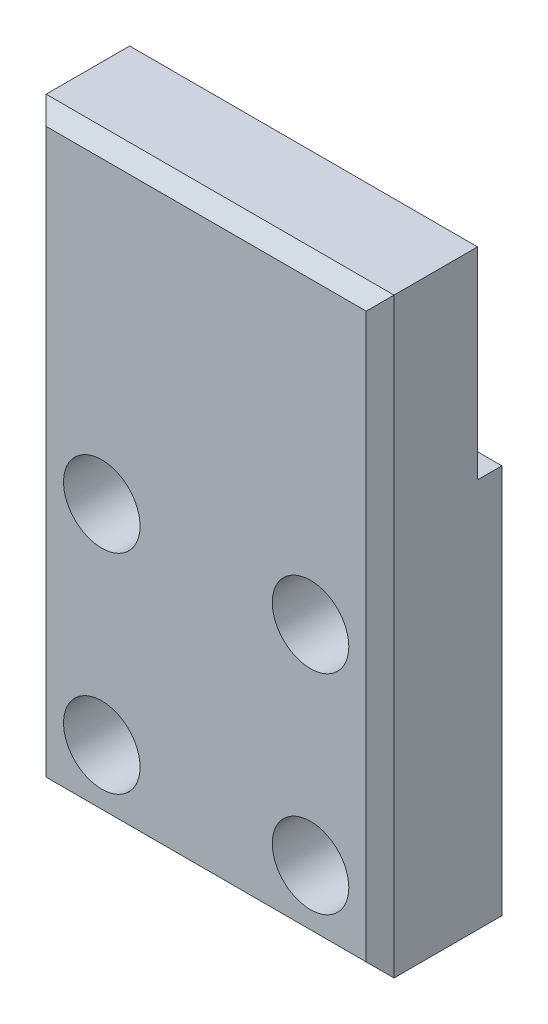
ISO-10303-21;
HEADER;
FILE_DESCRIPTION(('STEP AP214'),'2;1');
FILE_NAME('part.step','',(''),(''),'','','');
FILE_SCHEMA(('AUTOMOTIVE_DESIGN { 1 0 10303 214 1 1 1 1 }'));
ENDSEC;
DATA;
#1=APPLICATION_CONTEXT('core data for automotive mechanical design processes');
#2=APPLICATION_PROTOCOL_DEFINITION('international standard','automotive_design',2000,#1);
#3=PRODUCT_CONTEXT('',#1,'mechanical');
#4=PRODUCT('Part','Part','',(#3));
#5=PRODUCT_RELATED_PRODUCT_CATEGORY('part','',(#4));
#6=PRODUCT_DEFINITION_FORMATION('','',#4);
#7=PRODUCT_DEFINITION_CONTEXT('part definition',#1,'design');
#8=PRODUCT_DEFINITION('design','',#6,#7);
#9=PRODUCT_DEFINITION_SHAPE('','',#8);
#10=(LENGTH_UNIT() NAMED_UNIT(*) SI_UNIT(.MILLI.,.METRE.));
#11=(NAMED_UNIT(*) PLANE_ANGLE_UNIT() SI_UNIT($,.RADIAN.));
#12=(NAMED_UNIT(*) SI_UNIT($,.STERADIAN.) SOLID_ANGLE_UNIT());
#13=UNCERTAINTY_MEASURE_WITH_UNIT(LENGTH_MEASURE(1.E-05),#10,'distance_accuracy_value','');
#14=(GEOMETRIC_REPRESENTATION_CONTEXT(3) GLOBAL_UNCERTAINTY_ASSIGNED_CONTEXT((#13)) GLOBAL_UNIT_ASSIGNED_CONTEXT((#10,
#11,#12)) REPRESENTATION_CONTEXT('',''));
#15=CARTESIAN_POINT('',(0.,0.,0.));
#16=DIRECTION('',(0.,0.,1.));
#17=DIRECTION('',(1.,0.,0.));
#18=AXIS2_PLACEMENT_3D('',#15,#16,#17);
#19=CARTESIAN_POINT('',(0.,0.,300.));
#20=DIRECTION('',(0.,0.,-1.));
#21=DIRECTION('',(-1.,0.,0.));
#22=AXIS2_PLACEMENT_3D('',#19,#20,#21);
#23=PLANE('',#22);
#24=CARTESIAN_POINT('',(85.,50.,300.));
#25=DIRECTION('',(0.,0.,1.));
#26=DIRECTION('',(1.,0.,0.));
#27=AXIS2_PLACEMENT_3D('',#24,#25,#26);
#28=CIRCLE('',#27,5.5);
#29=CARTESIAN_POINT('',(90.5,50.,300.));
#30=VERTEX_POINT('',#29);
#31=EDGE_CURVE('E130',#30,#30,#28,.T.);
#32=ORIENTED_EDGE('',*,*,#31,.T.);
#33=EDGE_LOOP('',(#32));
#34=FACE_BOUND('',#33,.T.);
#35=CARTESIAN_POINT('',(115.,50.,300.));
#36=DIRECTION('',(0.,0.,1.));
#37=DIRECTION('',(1.,0.,0.));
#38=AXIS2_PLACEMENT_3D('',#35,#36,#37);
#39=CIRCLE('',#38,5.5);
#40=CARTESIAN_POINT('',(120.5,50.,300.));
#41=VERTEX_POINT('',#40);
#42=EDGE_CURVE('E136',#41,#41,#39,.T.);
#43=ORIENTED_EDGE('',*,*,#42,.T.);
#44=EDGE_LOOP('',(#43));
#45=FACE_BOUND('',#44,.T.);
#46=DIRECTION('',(1.,0.,0.));
#47=VECTOR('',#46,1.);
#48=CARTESIAN_POINT('',(115.,10.,300.));
#49=LINE('',#48,#47);
#50=CARTESIAN_POINT('',(75.,10.,300.));
#51=VERTEX_POINT('',#50);
#52=CARTESIAN_POINT('',(125.,10.,300.));
#53=VERTEX_POINT('',#52);
#54=EDGE_CURVE('E139',#51,#53,#49,.T.);
#55=ORIENTED_EDGE('',*,*,#54,.F.);
#56=DIRECTION('',(0.,-1.,0.));
#57=VECTOR('',#56,1.);
#58=CARTESIAN_POINT('',(75.,60.,300.));
#59=LINE('',#58,#57);
#60=CARTESIAN_POINT('',(75.,66.,300.));
#61=VERTEX_POINT('',#60);
#62=EDGE_CURVE('E143',#61,#51,#59,.T.);
#63=ORIENTED_EDGE('',*,*,#62,.F.);
#64=DIRECTION('',(-1.,0.,0.));
#65=VECTOR('',#64,1.);
#66=CARTESIAN_POINT('',(75.,66.,300.));
#67=LINE('',#66,#65);
#68=CARTESIAN_POINT('',(125.,66.,300.));
#69=VERTEX_POINT('',#68);
#70=EDGE_CURVE('E148',#69,#61,#67,.T.);
#71=ORIENTED_EDGE('',*,*,#70,.F.);
#72=DIRECTION('',(0.,1.,0.));
#73=VECTOR('',#72,1.);
#74=CARTESIAN_POINT('',(125.,60.,300.));
#75=LINE('',#74,#73);
#76=EDGE_CURVE('E146',#53,#69,#75,.T.);
#77=ORIENTED_EDGE('',*,*,#76,.F.);
#78=EDGE_LOOP('',(#55,#63,#71,#77));
#79=FACE_BOUND('',#78,.T.);
#80=CARTESIAN_POINT('',(85.,20.,300.));
#81=DIRECTION('',(0.,0.,1.));
#82=DIRECTION('',(1.,0.,0.));
#83=AXIS2_PLACEMENT_3D('',#80,#81,#82);
#84=CIRCLE('',#83,5.5);
#85=CARTESIAN_POINT('',(90.5,20.,300.));
#86=VERTEX_POINT('',#85);
#87=EDGE_CURVE('E133',#86,#86,#84,.T.);
#88=ORIENTED_EDGE('',*,*,#87,.T.);
#89=EDGE_LOOP('',(#88));
#90=FACE_BOUND('',#89,.T.);
#91=CARTESIAN_POINT('',(115.,20.,300.));
#92=DIRECTION('',(0.,0.,1.));
#93=DIRECTION('',(1.,0.,0.));
#94=AXIS2_PLACEMENT_3D('',#91,#92,#93);
#95=CIRCLE('',#94,5.5);
#96=CARTESIAN_POINT('',(120.5,20.,300.));
#97=VERTEX_POINT('',#96);
#98=EDGE_CURVE('E106',#97,#97,#95,.T.);
#99=ORIENTED_EDGE('',*,*,#98,.T.);
#100=EDGE_LOOP('',(#99));
#101=FACE_BOUND('',#100,.T.);
#102=ADVANCED_FACE('F35',(#34,#45,#79,#90,#101),#23,.T.);
#103=CARTESIAN_POINT('',(115.,10.,303.5));
#104=DIRECTION('',(0.,1.,0.));
#105=DIRECTION('',(0.,0.,1.));
#106=AXIS2_PLACEMENT_3D('',#103,#104,#105);
#107=PLANE('',#106);
#108=DIRECTION('',(0.,0.,-1.));
#109=VECTOR('',#108,1.);
#110=CARTESIAN_POINT('',(125.,10.,303.5));
#111=LINE('',#110,#109);
#112=CARTESIAN_POINT('',(125.,10.,315.5));
#113=VERTEX_POINT('',#112);
#114=EDGE_CURVE('E155',#113,#53,#111,.T.);
#115=ORIENTED_EDGE('',*,*,#114,.F.);
#116=DIRECTION('',(-1.,0.,0.));
#117=VECTOR('',#116,1.);
#118=CARTESIAN_POINT('',(115.,10.,315.5));
#119=LINE('',#118,#117);
#120=CARTESIAN_POINT('',(75.,10.,315.5));
#121=VERTEX_POINT('',#120);
#122=EDGE_CURVE('E168',#113,#121,#119,.T.);
#123=ORIENTED_EDGE('',*,*,#122,.T.);
#124=DIRECTION('',(0.,0.,-1.));
#125=VECTOR('',#124,1.);
#126=CARTESIAN_POINT('',(75.,10.,303.5));
#127=LINE('',#126,#125);
#128=EDGE_CURVE('E157',#121,#51,#127,.T.);
#129=ORIENTED_EDGE('',*,*,#128,.T.);
#130=ORIENTED_EDGE('',*,*,#54,.T.);
#131=EDGE_LOOP('',(#115,#123,#129,#130));
#132=FACE_BOUND('',#131,.T.);
#133=ADVANCED_FACE('F230',(#132),#107,.F.);
#134=CARTESIAN_POINT('',(125.,60.,303.5));
#135=DIRECTION('',(-1.,0.,0.));
#136=DIRECTION('',(0.,0.,1.));
#137=AXIS2_PLACEMENT_3D('',#134,#135,#136);
#138=PLANE('',#137);
#139=DIRECTION('',(0.,0.,-1.));
#140=VECTOR('',#139,1.);
#141=CARTESIAN_POINT('',(125.,95.,317.5));
#142=LINE('',#141,#140);
#143=CARTESIAN_POINT('',(125.,95.,315.5));
#144=VERTEX_POINT('',#143);
#145=CARTESIAN_POINT('',(125.,95.,303.5));
#146=VERTEX_POINT('',#145);
#147=EDGE_CURVE('E99',#144,#146,#142,.T.);
#148=ORIENTED_EDGE('',*,*,#147,.F.);
#149=DIRECTION('',(0.,-1.,0.));
#150=VECTOR('',#149,1.);
#151=CARTESIAN_POINT('',(125.,60.,315.5));
#152=LINE('',#151,#150);
#153=EDGE_CURVE('E171',#144,#113,#152,.T.);
#154=ORIENTED_EDGE('',*,*,#153,.T.);
#155=ORIENTED_EDGE('',*,*,#114,.T.);
#156=ORIENTED_EDGE('',*,*,#76,.T.);
#157=DIRECTION('',(0.,0.,-1.));
#158=VECTOR('',#157,1.);
#159=CARTESIAN_POINT('',(125.,66.,303.5));
#160=LINE('',#159,#158);
#161=CARTESIAN_POINT('',(125.,66.,303.5));
#162=VERTEX_POINT('',#161);
#163=EDGE_CURVE('E113',#162,#69,#160,.T.);
#164=ORIENTED_EDGE('',*,*,#163,.F.);
#165=DIRECTION('',(0.,1.,0.));
#166=VECTOR('',#165,1.);
#167=CARTESIAN_POINT('',(125.,95.,303.5));
#168=LINE('',#167,#166);
#169=EDGE_CURVE('E110',#162,#146,#168,.T.);
#170=ORIENTED_EDGE('',*,*,#169,.T.);
#171=EDGE_LOOP('',(#148,#154,#155,#156,#164,#170));
#172=FACE_BOUND('',#171,.T.);
#173=ADVANCED_FACE('F111',(#172),#138,.F.);
#174=CARTESIAN_POINT('',(75.,66.,303.5));
#175=DIRECTION('',(0.,-1.,0.));
#176=DIRECTION('',(0.,0.,-1.));
#177=AXIS2_PLACEMENT_3D('',#174,#175,#176);
#178=PLANE('',#177);
#179=ORIENTED_EDGE('',*,*,#70,.T.);
#180=DIRECTION('',(0.,0.,-1.));
#181=VECTOR('',#180,1.);
#182=CARTESIAN_POINT('',(75.,66.,303.5));
#183=LINE('',#182,#181);
#184=CARTESIAN_POINT('',(75.,66.,303.5));
#185=VERTEX_POINT('',#184);
#186=EDGE_CURVE('E142',#185,#61,#183,.T.);
#187=ORIENTED_EDGE('',*,*,#186,.F.);
#188=DIRECTION('',(-1.,0.,0.));
#189=VECTOR('',#188,1.);
#190=CARTESIAN_POINT('',(75.,66.,303.5));
#191=LINE('',#190,#189);
#192=EDGE_CURVE('E140',#162,#185,#191,.T.);
#193=ORIENTED_EDGE('',*,*,#192,.F.);
#194=ORIENTED_EDGE('',*,*,#163,.T.);
#195=EDGE_LOOP('',(#179,#187,#193,#194));
#196=FACE_BOUND('',#195,.T.);
#197=ADVANCED_FACE('F225',(#196),#178,.F.);
#198=CARTESIAN_POINT('',(75.,60.,303.5));
#199=DIRECTION('',(1.,0.,0.));
#200=DIRECTION('',(0.,1.,0.));
#201=AXIS2_PLACEMENT_3D('',#198,#199,#200);
#202=PLANE('',#201);
#203=ORIENTED_EDGE('',*,*,#128,.F.);
#204=DIRECTION('',(0.,1.,0.));
#205=VECTOR('',#204,1.);
#206=CARTESIAN_POINT('',(75.,60.,315.5));
#207=LINE('',#206,#205);
#208=CARTESIAN_POINT('',(75.,95.,315.5));
#209=VERTEX_POINT('',#208);
#210=EDGE_CURVE('E11',#121,#209,#207,.T.);
#211=ORIENTED_EDGE('',*,*,#210,.T.);
#212=DIRECTION('',(0.,0.,-1.));
#213=VECTOR('',#212,1.);
#214=CARTESIAN_POINT('',(75.,95.,317.5));
#215=LINE('',#214,#213);
#216=CARTESIAN_POINT('',(75.,95.,303.5));
#217=VERTEX_POINT('',#216);
#218=EDGE_CURVE('E107',#209,#217,#215,.T.);
#219=ORIENTED_EDGE('',*,*,#218,.T.);
#220=DIRECTION('',(0.,-1.,0.));
#221=VECTOR('',#220,1.);
#222=CARTESIAN_POINT('',(75.,10.,303.5));
#223=LINE('',#222,#221);
#224=EDGE_CURVE('E122',#217,#185,#223,.T.);
#225=ORIENTED_EDGE('',*,*,#224,.T.);
#226=ORIENTED_EDGE('',*,*,#186,.T.);
#227=ORIENTED_EDGE('',*,*,#62,.T.);
#228=EDGE_LOOP('',(#203,#211,#219,#225,#226,#227));
#229=FACE_BOUND('',#228,.T.);
#230=ADVANCED_FACE('F215',(#229),#202,.F.);
#231=CARTESIAN_POINT('',(115.,50.,303.5));
#232=DIRECTION('',(0.,0.,-1.));
#233=DIRECTION('',(-1.,0.,0.));
#234=AXIS2_PLACEMENT_3D('',#231,#232,#233);
#235=CYLINDRICAL_SURFACE('',#234,5.5);
#236=ORIENTED_EDGE('',*,*,#42,.F.);
#237=EDGE_LOOP('',(#236));
#238=FACE_BOUND('',#237,.T.);
#239=CARTESIAN_POINT('',(115.,50.,317.5));
#240=DIRECTION('',(0.,0.,1.));
#241=DIRECTION('',(1.,0.,0.));
#242=AXIS2_PLACEMENT_3D('',#239,#240,#241);
#243=CIRCLE('',#242,5.5);
#244=CARTESIAN_POINT('',(120.5,50.,317.5));
#245=VERTEX_POINT('',#244);
#246=EDGE_CURVE('E188',#245,#245,#243,.T.);
#247=ORIENTED_EDGE('',*,*,#246,.T.);
#248=EDGE_LOOP('',(#247));
#249=FACE_BOUND('',#248,.T.);
#250=ADVANCED_FACE('F213',(#238,#249),#235,.F.);
#251=CARTESIAN_POINT('',(85.,20.,303.5));
#252=DIRECTION('',(0.,0.,-1.));
#253=DIRECTION('',(-1.,0.,0.));
#254=AXIS2_PLACEMENT_3D('',#251,#252,#253);
#255=CYLINDRICAL_SURFACE('',#254,5.5);
#256=ORIENTED_EDGE('',*,*,#87,.F.);
#257=EDGE_LOOP('',(#256));
#258=FACE_BOUND('',#257,.T.);
#259=CARTESIAN_POINT('',(85.,20.,317.5));
#260=DIRECTION('',(0.,0.,1.));
#261=DIRECTION('',(1.,0.,0.));
#262=AXIS2_PLACEMENT_3D('',#259,#260,#261);
#263=CIRCLE('',#262,5.5);
#264=CARTESIAN_POINT('',(90.5,20.,317.5));
#265=VERTEX_POINT('',#264);
#266=EDGE_CURVE('E117',#265,#265,#263,.T.);
#267=ORIENTED_EDGE('',*,*,#266,.T.);
#268=EDGE_LOOP('',(#267));
#269=FACE_BOUND('',#268,.T.);
#270=ADVANCED_FACE('F200',(#258,#269),#255,.F.);
#271=CARTESIAN_POINT('',(85.,50.,303.5));
#272=DIRECTION('',(0.,0.,-1.));
#273=DIRECTION('',(-1.,0.,0.));
#274=AXIS2_PLACEMENT_3D('',#271,#272,#273);
#275=CYLINDRICAL_SURFACE('',#274,5.5);
#276=ORIENTED_EDGE('',*,*,#31,.F.);
#277=EDGE_LOOP('',(#276));
#278=FACE_BOUND('',#277,.T.);
#279=CARTESIAN_POINT('',(85.,50.,317.5));
#280=DIRECTION('',(0.,0.,1.));
#281=DIRECTION('',(1.,0.,0.));
#282=AXIS2_PLACEMENT_3D('',#279,#280,#281);
#283=CIRCLE('',#282,5.5);
#284=CARTESIAN_POINT('',(90.5,50.,317.5));
#285=VERTEX_POINT('',#284);
#286=EDGE_CURVE('E183',#285,#285,#283,.T.);
#287=ORIENTED_EDGE('',*,*,#286,.T.);
#288=EDGE_LOOP('',(#287));
#289=FACE_BOUND('',#288,.T.);
#290=ADVANCED_FACE('F222',(#278,#289),#275,.F.);
#291=CARTESIAN_POINT('',(115.,20.,303.5));
#292=DIRECTION('',(0.,0.,-1.));
#293=DIRECTION('',(-1.,0.,0.));
#294=AXIS2_PLACEMENT_3D('',#291,#292,#293);
#295=CYLINDRICAL_SURFACE('',#294,5.5);
#296=ORIENTED_EDGE('',*,*,#98,.F.);
#297=EDGE_LOOP('',(#296));
#298=FACE_BOUND('',#297,.T.);
#299=CARTESIAN_POINT('',(115.,20.,317.5));
#300=DIRECTION('',(0.,0.,1.));
#301=DIRECTION('',(1.,0.,0.));
#302=AXIS2_PLACEMENT_3D('',#299,#300,#301);
#303=CIRCLE('',#302,5.5);
#304=CARTESIAN_POINT('',(120.5,20.,317.5));
#305=VERTEX_POINT('',#304);
#306=EDGE_CURVE('E193',#305,#305,#303,.T.);
#307=ORIENTED_EDGE('',*,*,#306,.T.);
#308=EDGE_LOOP('',(#307));
#309=FACE_BOUND('',#308,.T.);
#310=ADVANCED_FACE('F205',(#298,#309),#295,.F.);
#311=CARTESIAN_POINT('',(0.,0.,317.5));
#312=DIRECTION('',(0.,0.,-1.));
#313=DIRECTION('',(-1.,0.,0.));
#314=AXIS2_PLACEMENT_3D('',#311,#312,#313);
#315=PLANE('',#314);
#316=DIRECTION('',(0.,-1.,0.));
#317=VECTOR('',#316,1.);
#318=CARTESIAN_POINT('',(76.9999999999999,-1.78098276866952E-13,317.5));
#319=LINE('',#318,#317);
#320=CARTESIAN_POINT('',(77.0000000000001,93.,317.5));
#321=VERTEX_POINT('',#320);
#322=CARTESIAN_POINT('',(76.9999999999999,12.,317.5));
#323=VERTEX_POINT('',#322);
#324=EDGE_CURVE('E159',#321,#323,#319,.T.);
#325=ORIENTED_EDGE('',*,*,#324,.T.);
#326=DIRECTION('',(1.,0.,0.));
#327=VECTOR('',#326,1.);
#328=CARTESIAN_POINT('',(0.,12.,317.5));
#329=LINE('',#328,#327);
#330=CARTESIAN_POINT('',(123.,12.,317.5));
#331=VERTEX_POINT('',#330);
#332=EDGE_CURVE('E165',#323,#331,#329,.T.);
#333=ORIENTED_EDGE('',*,*,#332,.T.);
#334=DIRECTION('',(0.,1.,0.));
#335=VECTOR('',#334,1.);
#336=CARTESIAN_POINT('',(123.,0.,317.5));
#337=LINE('',#336,#335);
#338=CARTESIAN_POINT('',(123.,93.,317.5));
#339=VERTEX_POINT('',#338);
#340=EDGE_CURVE('E163',#331,#339,#337,.T.);
#341=ORIENTED_EDGE('',*,*,#340,.T.);
#342=DIRECTION('',(-1.,0.,0.));
#343=VECTOR('',#342,1.);
#344=CARTESIAN_POINT('',(0.,93.,317.5));
#345=LINE('',#344,#343);
#346=EDGE_CURVE('E161',#339,#321,#345,.T.);
#347=ORIENTED_EDGE('',*,*,#346,.T.);
#348=EDGE_LOOP('',(#325,#333,#341,#347));
#349=FACE_BOUND('',#348,.T.);
#350=ORIENTED_EDGE('',*,*,#266,.F.);
#351=EDGE_LOOP('',(#350));
#352=FACE_BOUND('',#351,.T.);
#353=ORIENTED_EDGE('',*,*,#306,.F.);
#354=EDGE_LOOP('',(#353));
#355=FACE_BOUND('',#354,.T.);
#356=ORIENTED_EDGE('',*,*,#246,.F.);
#357=EDGE_LOOP('',(#356));
#358=FACE_BOUND('',#357,.T.);
#359=ORIENTED_EDGE('',*,*,#286,.F.);
#360=EDGE_LOOP('',(#359));
#361=FACE_BOUND('',#360,.T.);
#362=ADVANCED_FACE('F202',(#349,#352,#355,#358,#361),#315,.F.);
#363=CARTESIAN_POINT('',(0.,0.,303.5));
#364=DIRECTION('',(0.,0.,-1.));
#365=DIRECTION('',(-1.,0.,0.));
#366=AXIS2_PLACEMENT_3D('',#363,#364,#365);
#367=PLANE('',#366);
#368=ORIENTED_EDGE('',*,*,#169,.F.);
#369=ORIENTED_EDGE('',*,*,#192,.T.);
#370=ORIENTED_EDGE('',*,*,#224,.F.);
#371=DIRECTION('',(-1.,0.,0.));
#372=VECTOR('',#371,1.);
#373=CARTESIAN_POINT('',(75.,95.,303.5));
#374=LINE('',#373,#372);
#375=EDGE_CURVE('E103',#146,#217,#374,.T.);
#376=ORIENTED_EDGE('',*,*,#375,.F.);
#377=EDGE_LOOP('',(#368,#369,#370,#376));
#378=FACE_BOUND('',#377,.T.);
#379=ADVANCED_FACE('F120',(#378),#367,.T.);
#380=CARTESIAN_POINT('',(75.,95.,317.5));
#381=DIRECTION('',(0.,-1.,0.));
#382=DIRECTION('',(0.,0.,-1.));
#383=AXIS2_PLACEMENT_3D('',#380,#381,#382);
#384=PLANE('',#383);
#385=ORIENTED_EDGE('',*,*,#218,.F.);
#386=DIRECTION('',(1.,0.,0.));
#387=VECTOR('',#386,1.);
#388=CARTESIAN_POINT('',(75.,95.,315.5));
#389=LINE('',#388,#387);
#390=EDGE_CURVE('E45',#209,#144,#389,.T.);
#391=ORIENTED_EDGE('',*,*,#390,.T.);
#392=ORIENTED_EDGE('',*,*,#147,.T.);
#393=ORIENTED_EDGE('',*,*,#375,.T.);
#394=EDGE_LOOP('',(#385,#391,#392,#393));
#395=FACE_BOUND('',#394,.T.);
#396=ADVANCED_FACE('F101',(#395),#384,.F.);
#397=CARTESIAN_POINT('',(0.,93.,317.5));
#398=DIRECTION('',(0.,-0.707106781186547,-0.707106781186547));
#399=DIRECTION('',(-1.,0.,0.));
#400=AXIS2_PLACEMENT_3D('',#397,#398,#399);
#401=PLANE('',#400);
#402=DIRECTION('',(0.577350269189626,0.577350269189626,-0.577350269189626));
#403=VECTOR('',#402,1.);
#404=CARTESIAN_POINT('',(82.,52.,358.5));
#405=LINE('',#404,#403);
#406=EDGE_CURVE('E177',#144,#339,#405,.F.);
#407=ORIENTED_EDGE('',*,*,#406,.F.);
#408=ORIENTED_EDGE('',*,*,#390,.F.);
#409=DIRECTION('',(-0.577350269189625,0.577350269189626,-0.577350269189626));
#410=VECTOR('',#409,1.);
#411=CARTESIAN_POINT('',(108.,62.,348.5));
#412=LINE('',#411,#410);
#413=EDGE_CURVE('E40',#321,#209,#412,.T.);
#414=ORIENTED_EDGE('',*,*,#413,.F.);
#415=ORIENTED_EDGE('',*,*,#346,.F.);
#416=EDGE_LOOP('',(#407,#408,#414,#415));
#417=FACE_BOUND('',#416,.T.);
#418=ADVANCED_FACE('F38',(#417),#401,.F.);
#419=CARTESIAN_POINT('',(76.9999999999999,-1.78098276866952E-13,317.5));
#420=DIRECTION('',(0.707106781186547,0.,-0.707106781186547));
#421=DIRECTION('',(0.,-1.,0.));
#422=AXIS2_PLACEMENT_3D('',#419,#420,#421);
#423=PLANE('',#422);
#424=ORIENTED_EDGE('',*,*,#413,.T.);
#425=ORIENTED_EDGE('',*,*,#210,.F.);
#426=DIRECTION('',(0.577350269189627,0.577350269189625,0.577350269189625));
#427=VECTOR('',#426,1.);
#428=CARTESIAN_POINT('',(72.9999999999998,7.99999999999996,313.5));
#429=LINE('',#428,#427);
#430=EDGE_CURVE('E176',#323,#121,#429,.F.);
#431=ORIENTED_EDGE('',*,*,#430,.F.);
#432=ORIENTED_EDGE('',*,*,#324,.F.);
#433=EDGE_LOOP('',(#424,#425,#431,#432));
#434=FACE_BOUND('',#433,.T.);
#435=ADVANCED_FACE('F257',(#434),#423,.F.);
#436=CARTESIAN_POINT('',(123.,0.,317.5));
#437=DIRECTION('',(-0.707106781186547,0.,-0.707106781186547));
#438=DIRECTION('',(0.,1.,0.));
#439=AXIS2_PLACEMENT_3D('',#436,#437,#438);
#440=PLANE('',#439);
#441=ORIENTED_EDGE('',*,*,#406,.T.);
#442=ORIENTED_EDGE('',*,*,#340,.F.);
#443=DIRECTION('',(0.577350269189626,-0.577350269189626,-0.577350269189626));
#444=VECTOR('',#443,1.);
#445=CARTESIAN_POINT('',(127.,8.00000000000002,313.5));
#446=LINE('',#445,#444);
#447=EDGE_CURVE('E174',#113,#331,#446,.F.);
#448=ORIENTED_EDGE('',*,*,#447,.F.);
#449=ORIENTED_EDGE('',*,*,#153,.F.);
#450=EDGE_LOOP('',(#441,#442,#448,#449));
#451=FACE_BOUND('',#450,.T.);
#452=ADVANCED_FACE('F251',(#451),#440,.F.);
#453=CARTESIAN_POINT('',(0.,12.,317.5));
#454=DIRECTION('',(0.,0.707106781186547,-0.707106781186547));
#455=DIRECTION('',(1.,0.,0.));
#456=AXIS2_PLACEMENT_3D('',#453,#454,#455);
#457=PLANE('',#456);
#458=ORIENTED_EDGE('',*,*,#430,.T.);
#459=ORIENTED_EDGE('',*,*,#122,.F.);
#460=ORIENTED_EDGE('',*,*,#447,.T.);
#461=ORIENTED_EDGE('',*,*,#332,.F.);
#462=EDGE_LOOP('',(#458,#459,#460,#461));
#463=FACE_BOUND('',#462,.T.);
#464=ADVANCED_FACE('F245',(#463),#457,.F.);
#465=CLOSED_SHELL('',(#102,#133,#173,#197,#230,#250,#270,#290,#310,#362,#379,#396,#418,#435,
#452,#464));
#466=MANIFOLD_SOLID_BREP('B2',#465);
#467=ADVANCED_BREP_SHAPE_REPRESENTATION('',(#18,#466),#14);
#468=SHAPE_DEFINITION_REPRESENTATION(#9,#467);
ENDSEC;
END-ISO-10303-21;
